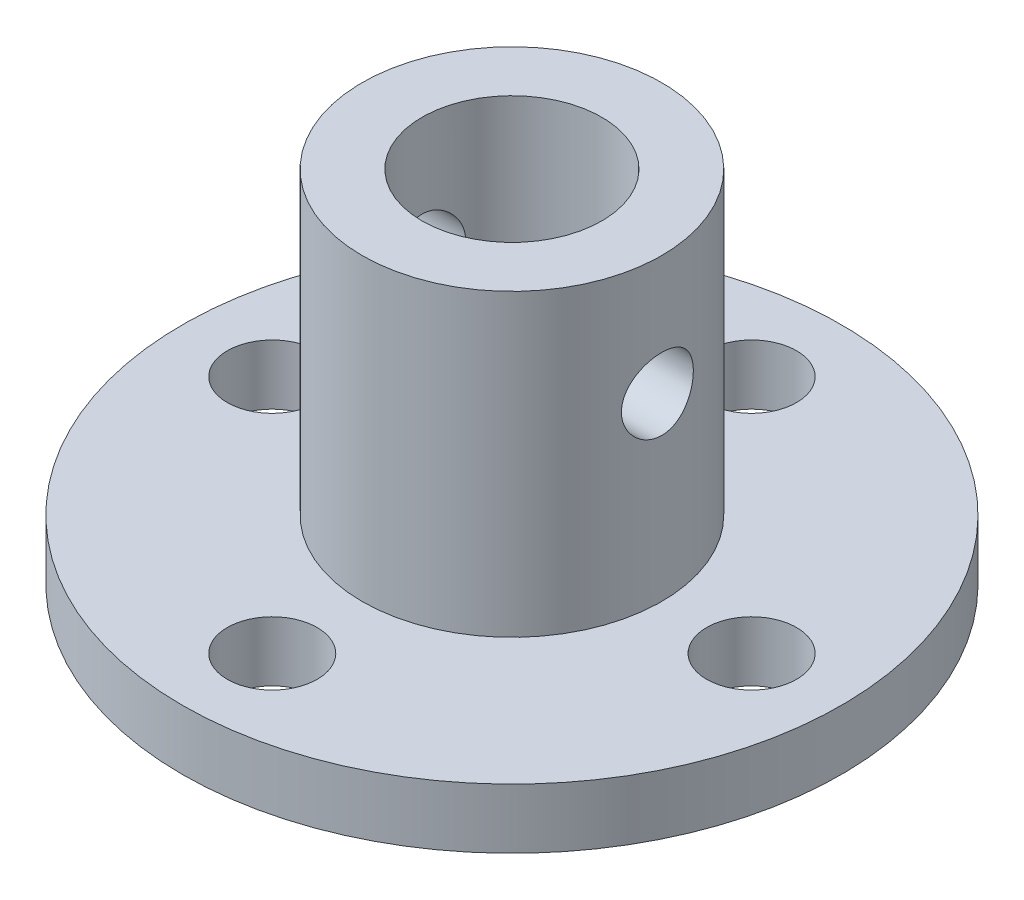
ISO-10303-21;
HEADER;
FILE_DESCRIPTION(('STEP AP214'),'2;1');
FILE_NAME('part.step','',(''),(''),'','','');
FILE_SCHEMA(('AUTOMOTIVE_DESIGN { 1 0 10303 214 1 1 1 1 }'));
ENDSEC;
DATA;
#1=APPLICATION_CONTEXT('core data for automotive mechanical design processes');
#2=APPLICATION_PROTOCOL_DEFINITION('international standard','automotive_design',2000,#1);
#3=PRODUCT_CONTEXT('',#1,'mechanical');
#4=PRODUCT('Part','Part','',(#3));
#5=PRODUCT_RELATED_PRODUCT_CATEGORY('part','',(#4));
#6=PRODUCT_DEFINITION_FORMATION('','',#4);
#7=PRODUCT_DEFINITION_CONTEXT('part definition',#1,'design');
#8=PRODUCT_DEFINITION('design','',#6,#7);
#9=PRODUCT_DEFINITION_SHAPE('','',#8);
#10=(LENGTH_UNIT() NAMED_UNIT(*) SI_UNIT(.MILLI.,.METRE.));
#11=(NAMED_UNIT(*) PLANE_ANGLE_UNIT() SI_UNIT($,.RADIAN.));
#12=(NAMED_UNIT(*) SI_UNIT($,.STERADIAN.) SOLID_ANGLE_UNIT());
#13=UNCERTAINTY_MEASURE_WITH_UNIT(LENGTH_MEASURE(1.E-05),#10,'distance_accuracy_value','');
#14=(GEOMETRIC_REPRESENTATION_CONTEXT(3) GLOBAL_UNCERTAINTY_ASSIGNED_CONTEXT((#13)) GLOBAL_UNIT_ASSIGNED_CONTEXT((#10,
#11,#12)) REPRESENTATION_CONTEXT('',''));
#15=CARTESIAN_POINT('',(0.,0.,0.));
#16=DIRECTION('',(0.,0.,1.));
#17=DIRECTION('',(1.,0.,0.));
#18=AXIS2_PLACEMENT_3D('',#15,#16,#17);
#19=CARTESIAN_POINT('',(0.,2.,0.));
#20=DIRECTION('',(0.,-1.,0.));
#21=DIRECTION('',(0.,0.,-1.));
#22=AXIS2_PLACEMENT_3D('',#19,#20,#21);
#23=CYLINDRICAL_SURFACE('',#22,11.);
#24=CARTESIAN_POINT('',(0.,2.,0.));
#25=DIRECTION('',(0.,1.,0.));
#26=DIRECTION('',(0.,0.,1.));
#27=AXIS2_PLACEMENT_3D('',#24,#25,#26);
#28=CIRCLE('',#27,11.);
#29=CARTESIAN_POINT('',(0.,2.,11.));
#30=VERTEX_POINT('',#29);
#31=EDGE_CURVE('E10',#30,#30,#28,.T.);
#32=ORIENTED_EDGE('',*,*,#31,.F.);
#33=EDGE_LOOP('',(#32));
#34=FACE_BOUND('',#33,.T.);
#35=CARTESIAN_POINT('',(0.,0.,0.));
#36=DIRECTION('',(0.,1.,0.));
#37=DIRECTION('',(0.,0.,1.));
#38=AXIS2_PLACEMENT_3D('',#35,#36,#37);
#39=CIRCLE('',#38,11.);
#40=CARTESIAN_POINT('',(0.,0.,11.));
#41=VERTEX_POINT('',#40);
#42=EDGE_CURVE('E44',#41,#41,#39,.T.);
#43=ORIENTED_EDGE('',*,*,#42,.T.);
#44=EDGE_LOOP('',(#43));
#45=FACE_BOUND('',#44,.T.);
#46=ADVANCED_FACE('F32',(#34,#45),#23,.T.);
#47=CARTESIAN_POINT('',(0.,2.,0.));
#48=DIRECTION('',(0.,1.,0.));
#49=DIRECTION('',(0.,0.,1.));
#50=AXIS2_PLACEMENT_3D('',#47,#48,#49);
#51=PLANE('',#50);
#52=CARTESIAN_POINT('',(8.00000000000023,2.,-2.26393958003914E-13));
#53=DIRECTION('',(0.,1.,0.));
#54=DIRECTION('',(0.,0.,1.));
#55=AXIS2_PLACEMENT_3D('',#52,#53,#54);
#56=CIRCLE('',#55,1.50000000000018);
#57=CARTESIAN_POINT('',(8.00000000000023,2.,1.49999999999995));
#58=VERTEX_POINT('',#57);
#59=EDGE_CURVE('E64',#58,#58,#56,.T.);
#60=ORIENTED_EDGE('',*,*,#59,.F.);
#61=EDGE_LOOP('',(#60));
#62=FACE_BOUND('',#61,.T.);
#63=CARTESIAN_POINT('',(4.52787916007828E-13,2.,8.));
#64=DIRECTION('',(0.,1.,0.));
#65=DIRECTION('',(0.,0.,1.));
#66=AXIS2_PLACEMENT_3D('',#63,#64,#65);
#67=CIRCLE('',#66,1.50000000000049);
#68=CARTESIAN_POINT('',(4.52787916007828E-13,2.,9.50000000000049));
#69=VERTEX_POINT('',#68);
#70=EDGE_CURVE('E229',#69,#69,#67,.T.);
#71=ORIENTED_EDGE('',*,*,#70,.F.);
#72=EDGE_LOOP('',(#71));
#73=FACE_BOUND('',#72,.T.);
#74=CARTESIAN_POINT('',(-7.99999999999977,2.,2.27373675443232E-13));
#75=DIRECTION('',(0.,1.,0.));
#76=DIRECTION('',(0.,0.,1.));
#77=AXIS2_PLACEMENT_3D('',#74,#75,#76);
#78=CIRCLE('',#77,1.50000000000036);
#79=CARTESIAN_POINT('',(-7.99999999999977,2.,1.50000000000059));
#80=VERTEX_POINT('',#79);
#81=EDGE_CURVE('E226',#80,#80,#78,.T.);
#82=ORIENTED_EDGE('',*,*,#81,.F.);
#83=EDGE_LOOP('',(#82));
#84=FACE_BOUND('',#83,.T.);
#85=CARTESIAN_POINT('',(0.,2.,-8.));
#86=DIRECTION('',(0.,1.,0.));
#87=DIRECTION('',(0.,0.,1.));
#88=AXIS2_PLACEMENT_3D('',#85,#86,#87);
#89=CIRCLE('',#88,1.5);
#90=CARTESIAN_POINT('',(0.,2.,-6.5));
#91=VERTEX_POINT('',#90);
#92=EDGE_CURVE('E59',#91,#91,#89,.T.);
#93=ORIENTED_EDGE('',*,*,#92,.F.);
#94=EDGE_LOOP('',(#93));
#95=FACE_BOUND('',#94,.T.);
#96=CARTESIAN_POINT('',(0.,2.,0.));
#97=DIRECTION('',(0.,1.,0.));
#98=DIRECTION('',(0.,0.,1.));
#99=AXIS2_PLACEMENT_3D('',#96,#97,#98);
#100=CIRCLE('',#99,5.);
#101=CARTESIAN_POINT('',(0.,2.,5.));
#102=VERTEX_POINT('',#101);
#103=EDGE_CURVE('E52',#102,#102,#100,.T.);
#104=ORIENTED_EDGE('',*,*,#103,.F.);
#105=EDGE_LOOP('',(#104));
#106=FACE_BOUND('',#105,.T.);
#107=ORIENTED_EDGE('',*,*,#31,.T.);
#108=EDGE_LOOP('',(#107));
#109=FACE_BOUND('',#108,.T.);
#110=ADVANCED_FACE('F109',(#62,#73,#84,#95,#106,#109),#51,.T.);
#111=CARTESIAN_POINT('',(0.,0.,0.));
#112=DIRECTION('',(0.,1.,0.));
#113=DIRECTION('',(0.,0.,1.));
#114=AXIS2_PLACEMENT_3D('',#111,#112,#113);
#115=PLANE('',#114);
#116=CARTESIAN_POINT('',(8.00000000000023,0.,-2.26393958003914E-13));
#117=DIRECTION('',(0.,1.,0.));
#118=DIRECTION('',(0.,0.,1.));
#119=AXIS2_PLACEMENT_3D('',#116,#117,#118);
#120=CIRCLE('',#119,1.50000000000018);
#121=CARTESIAN_POINT('',(8.00000000000023,0.,1.49999999999995));
#122=VERTEX_POINT('',#121);
#123=EDGE_CURVE('E67',#122,#122,#120,.T.);
#124=ORIENTED_EDGE('',*,*,#123,.T.);
#125=EDGE_LOOP('',(#124));
#126=FACE_BOUND('',#125,.T.);
#127=CARTESIAN_POINT('',(4.52787916007828E-13,0.,8.));
#128=DIRECTION('',(0.,1.,0.));
#129=DIRECTION('',(0.,0.,1.));
#130=AXIS2_PLACEMENT_3D('',#127,#128,#129);
#131=CIRCLE('',#130,1.50000000000049);
#132=CARTESIAN_POINT('',(4.52787916007828E-13,0.,9.50000000000049));
#133=VERTEX_POINT('',#132);
#134=EDGE_CURVE('E63',#133,#133,#131,.T.);
#135=ORIENTED_EDGE('',*,*,#134,.T.);
#136=EDGE_LOOP('',(#135));
#137=FACE_BOUND('',#136,.T.);
#138=CARTESIAN_POINT('',(-7.99999999999977,0.,2.27373675443232E-13));
#139=DIRECTION('',(0.,1.,0.));
#140=DIRECTION('',(0.,0.,1.));
#141=AXIS2_PLACEMENT_3D('',#138,#139,#140);
#142=CIRCLE('',#141,1.50000000000036);
#143=CARTESIAN_POINT('',(-7.99999999999977,0.,1.50000000000059));
#144=VERTEX_POINT('',#143);
#145=EDGE_CURVE('E60',#144,#144,#142,.T.);
#146=ORIENTED_EDGE('',*,*,#145,.T.);
#147=EDGE_LOOP('',(#146));
#148=FACE_BOUND('',#147,.T.);
#149=CARTESIAN_POINT('',(0.,0.,-8.));
#150=DIRECTION('',(0.,1.,0.));
#151=DIRECTION('',(0.,0.,1.));
#152=AXIS2_PLACEMENT_3D('',#149,#150,#151);
#153=CIRCLE('',#152,1.5);
#154=CARTESIAN_POINT('',(0.,0.,-6.5));
#155=VERTEX_POINT('',#154);
#156=EDGE_CURVE('E55',#155,#155,#153,.T.);
#157=ORIENTED_EDGE('',*,*,#156,.T.);
#158=EDGE_LOOP('',(#157));
#159=FACE_BOUND('',#158,.T.);
#160=CARTESIAN_POINT('',(0.,0.,0.));
#161=DIRECTION('',(0.,1.,0.));
#162=DIRECTION('',(0.,0.,1.));
#163=AXIS2_PLACEMENT_3D('',#160,#161,#162);
#164=CIRCLE('',#163,3.);
#165=CARTESIAN_POINT('',(0.,0.,3.));
#166=VERTEX_POINT('',#165);
#167=EDGE_CURVE('E216',#166,#166,#164,.T.);
#168=ORIENTED_EDGE('',*,*,#167,.T.);
#169=EDGE_LOOP('',(#168));
#170=FACE_BOUND('',#169,.T.);
#171=ORIENTED_EDGE('',*,*,#42,.F.);
#172=EDGE_LOOP('',(#171));
#173=FACE_BOUND('',#172,.T.);
#174=ADVANCED_FACE('F107',(#126,#137,#148,#159,#170,#173),#115,.F.);
#175=CARTESIAN_POINT('',(0.,12.,0.));
#176=DIRECTION('',(0.,-1.,0.));
#177=DIRECTION('',(0.,0.,-1.));
#178=AXIS2_PLACEMENT_3D('',#175,#176,#177);
#179=CYLINDRICAL_SURFACE('',#178,5.);
#180=CARTESIAN_POINT('',(-4.85386443980464,8.,-1.2));
#181=CARTESIAN_POINT('',(-4.85386574834956,8.06635452557652,-1.1999979705578));
#182=CARTESIAN_POINT('',(-4.85523993119247,8.13273212072872,-1.19447760630204));
#183=CARTESIAN_POINT('',(-4.8605754799883,8.2635873410881,-1.17257348950943));
#184=CARTESIAN_POINT('',(-4.86453847215855,8.32806374539526,-1.156182908509));
#185=CARTESIAN_POINT('',(-4.87457754147826,8.4532049181611,-1.11309435138135));
#186=CARTESIAN_POINT('',(-4.88065102731292,8.51387425367759,-1.08640901099969));
#187=CARTESIAN_POINT('',(-4.89422356910218,8.62987981746289,-1.02352620715788));
#188=CARTESIAN_POINT('',(-4.90172265612421,8.68521592946782,-0.98732853639367));
#189=CARTESIAN_POINT('',(-4.91747172337779,8.79010752597607,-0.905664368660577));
#190=CARTESIAN_POINT('',(-4.92573292327146,8.83953886239581,-0.860040546351182));
#191=CARTESIAN_POINT('',(-4.94197776786566,8.93012615777367,-0.761158305263485));
#192=CARTESIAN_POINT('',(-4.94996138808952,8.97128138847705,-0.707899215326602));
#193=CARTESIAN_POINT('',(-4.96487503831898,9.0446505730824,-0.594413740032978));
#194=CARTESIAN_POINT('',(-4.9717902836032,9.07674340941971,-0.534106940562792));
#195=CARTESIAN_POINT('',(-4.98366044385166,9.13029061492714,-0.408761457376199));
#196=CARTESIAN_POINT('',(-4.98861562472599,9.15174642725813,-0.34372341693697));
#197=CARTESIAN_POINT('',(-4.99592803621097,9.18301526175459,-0.212054861119564));
#198=CARTESIAN_POINT('',(-4.99833220128179,9.19303888568329,-0.145477011016399));
#199=CARTESIAN_POINT('',(-5.00043493925753,9.20181900787666,-0.0115442295903432));
#200=CARTESIAN_POINT('',(-5.00013388201989,9.20057704636966,0.055810594247324));
#201=CARTESIAN_POINT('',(-4.99689534571203,9.187014519686,0.187927678875519));
#202=CARTESIAN_POINT('',(-4.99401193949727,9.17492116633258,0.252714787646842));
#203=CARTESIAN_POINT('',(-4.98599518389802,9.14036330481486,0.379311966331709));
#204=CARTESIAN_POINT('',(-4.98086172025245,9.11789826995886,0.441121884882393));
#205=CARTESIAN_POINT('',(-4.96883750692918,9.06304526690089,0.56061940318406));
#206=CARTESIAN_POINT('',(-4.9619322123624,9.03057469769263,0.618267562959191));
#207=CARTESIAN_POINT('',(-4.94711614602281,8.95669462653349,0.727377499260279));
#208=CARTESIAN_POINT('',(-4.93920521180944,8.91528367969069,0.778838273721493));
#209=CARTESIAN_POINT('',(-4.92300938183712,8.82347383956616,0.875466704291571));
#210=CARTESIAN_POINT('',(-4.91472008098886,8.77287625353241,0.920445028443142));
#211=CARTESIAN_POINT('',(-4.89888404902298,8.66476974553664,1.00131821955703));
#212=CARTESIAN_POINT('',(-4.89133734727314,8.60726055043877,1.03721272736709));
#213=CARTESIAN_POINT('',(-4.87782644988181,8.48661389749472,1.09900794525505));
#214=CARTESIAN_POINT('',(-4.8718689814022,8.42345397956931,1.12486637653164));
#215=CARTESIAN_POINT('',(-4.86229932919542,8.2935067506094,1.16554129726684));
#216=CARTESIAN_POINT('',(-4.85868668784527,8.22672015012718,1.18035994136453));
#217=CARTESIAN_POINT('',(-4.8543109065439,8.0931626479757,1.19822740093828));
#218=CARTESIAN_POINT('',(-4.85348035194831,8.02643117100062,1.20155473331588));
#219=CARTESIAN_POINT('',(-4.85457982488721,7.89336672237327,1.19710481364215));
#220=CARTESIAN_POINT('',(-4.85650962025667,7.82703371767786,1.18932849548677));
#221=CARTESIAN_POINT('',(-4.8628480607639,7.69766163309304,1.16313540811095));
#222=CARTESIAN_POINT('',(-4.86721959037932,7.63458832963254,1.14487784593919));
#223=CARTESIAN_POINT('',(-4.87791428510207,7.51239687173387,1.0984156599552));
#224=CARTESIAN_POINT('',(-4.88423766714648,7.45327915782567,1.07020993041214));
#225=CARTESIAN_POINT('',(-4.89826757064917,7.33948849911823,1.00405897470492));
#226=CARTESIAN_POINT('',(-4.90599720896891,7.28491625039753,0.965945543261206));
#227=CARTESIAN_POINT('',(-4.92191059520354,7.18283970644249,0.881276206441526));
#228=CARTESIAN_POINT('',(-4.93009441150586,7.13533647960583,0.834719027249052));
#229=CARTESIAN_POINT('',(-4.94622044561256,7.04763399615629,0.733211442050559));
#230=CARTESIAN_POINT('',(-4.95415286604867,7.00762649760413,0.678093519796222));
#231=CARTESIAN_POINT('',(-4.96868773599825,6.93743661476599,0.561759047226883));
#232=CARTESIAN_POINT('',(-4.97529025311405,6.90725373102214,0.500542807141209));
#233=CARTESIAN_POINT('',(-4.98638083813349,6.85782100908999,0.374162473013356));
#234=CARTESIAN_POINT('',(-4.99088358502535,6.83849507179135,0.309029492813407));
#235=CARTESIAN_POINT('',(-4.99733131235137,6.81109287184125,0.176319006648483));
#236=CARTESIAN_POINT('',(-4.99927674530205,6.8030146188978,0.108741935340385));
#237=CARTESIAN_POINT('',(-5.00037384681398,6.79844165288519,-0.0251309330151677));
#238=CARTESIAN_POINT('',(-4.99959402361891,6.80166289762338,-0.0914166194368341));
#239=CARTESIAN_POINT('',(-4.99547843914621,6.818951985207,-0.222472635242497));
#240=CARTESIAN_POINT('',(-4.99214274325727,6.83301955056341,-0.287243003350266));
#241=CARTESIAN_POINT('',(-4.98329901613138,6.87145473004636,-0.413158134552165));
#242=CARTESIAN_POINT('',(-4.97780105635323,6.89577462777663,-0.474318216072177));
#243=CARTESIAN_POINT('',(-4.96521431839506,6.95398009765915,-0.591723649676363));
#244=CARTESIAN_POINT('',(-4.95812535402572,6.98786678949741,-0.647968425469445));
#245=CARTESIAN_POINT('',(-4.94292611630122,7.06513018971189,-0.755306804615817));
#246=CARTESIAN_POINT('',(-4.93479656171732,7.10870202830168,-0.806257226493132));
#247=CARTESIAN_POINT('',(-4.91852450984834,7.20371504423164,-0.90021980625846));
#248=CARTESIAN_POINT('',(-4.9103820098469,7.25515817627866,-0.943229986447174));
#249=CARTESIAN_POINT('',(-4.89485102555881,7.36549575767818,-1.02079794075124));
#250=CARTESIAN_POINT('',(-4.8874775389275,7.42450104825922,-1.05520126656998));
#251=CARTESIAN_POINT('',(-4.87451638676983,7.5476247386592,-1.1135482836119));
#252=CARTESIAN_POINT('',(-4.86892735049339,7.61173916628369,-1.13750000858815));
#253=CARTESIAN_POINT('',(-4.86109564328101,7.72983714139588,-1.17045774554031));
#254=CARTESIAN_POINT('',(-4.85840351753819,7.78322833128185,-1.18151294684131));
#255=CARTESIAN_POINT('',(-4.85478744190151,7.89107454963095,-1.19628464477187));
#256=CARTESIAN_POINT('',(-4.85386336561877,7.94552950176998,-1.20000166597119));
#257=CARTESIAN_POINT('',(-4.85386443980464,8.,-1.2));
#258=B_SPLINE_CURVE_WITH_KNOTS('',3,(#180,#181,#182,#183,#184,#185,#186,#187,#188,#189,#190,
#191,#192,#193,#194,#195,#196,#197,#198,#199,#200,#201,#202,#203,#204,#205,#206,#207,#208,#209,
#210,#211,#212,#213,#214,#215,#216,#217,#218,#219,#220,#221,#222,#223,#224,#225,#226,#227,#228,
#229,#230,#231,#232,#233,#234,#235,#236,#237,#238,#239,#240,#241,#242,#243,#244,#245,#246,#247,
#248,#249,#250,#251,#252,#253,#254,#255,#256,#257),.UNSPECIFIED.,.T.,.F.,(4,2,2,2,2,2,2,2,2,2,2,
2,2,2,2,2,2,2,2,2,2,2,2,2,2,2,2,2,2,2,2,2,2,2,2,2,2,2,4),(0.,0.198863684875774,0.39785241061556,
0.596597671501016,0.795347264039442,0.99772967277618,1.20012988233894,1.40511932306521,
1.61008094456725,1.81120251394427,2.01229658643974,2.20927584611689,2.40626510983779,
2.60492628768566,2.80361959606555,3.00727667386884,3.21094180252581,3.41545582890608,
3.61992992974891,3.81941198396489,4.01887726131023,4.2153899929423,4.4119245736942,
4.61204261040561,4.81219086190157,5.01691376492014,5.22162625873254,5.42488537167321,
5.62810851308336,5.82626011732859,6.02440665229056,6.22164098170181,6.41889840475702,
6.6205634308204,6.82227861861519,7.02738891173642,7.23234126535601,7.39560033961485,
7.55884774287673),.UNSPECIFIED.);
#259=CARTESIAN_POINT('',(-4.85386443980464,8.,-1.2));
#260=VERTEX_POINT('',#259);
#261=EDGE_CURVE('E97',#260,#260,#258,.T.);
#262=ORIENTED_EDGE('',*,*,#261,.T.);
#263=EDGE_LOOP('',(#262));
#264=FACE_BOUND('',#263,.T.);
#265=CARTESIAN_POINT('',(4.85386443980464,8.,-1.2));
#266=CARTESIAN_POINT('',(4.85386574834956,7.93364547442348,-1.1999979705578));
#267=CARTESIAN_POINT('',(4.85523993119247,7.86726787927128,-1.19447760630204));
#268=CARTESIAN_POINT('',(4.8605754799883,7.7364126589119,-1.17257348950943));
#269=CARTESIAN_POINT('',(4.86453847215855,7.67193625460474,-1.156182908509));
#270=CARTESIAN_POINT('',(4.87457754147826,7.5467950818389,-1.11309435138135));
#271=CARTESIAN_POINT('',(4.88065102731292,7.48612574632241,-1.08640901099969));
#272=CARTESIAN_POINT('',(4.89422356910218,7.37012018253711,-1.02352620715788));
#273=CARTESIAN_POINT('',(4.90172265612421,7.31478407053218,-0.987328536393669));
#274=CARTESIAN_POINT('',(4.91747172337779,7.20989247402393,-0.905664368660575));
#275=CARTESIAN_POINT('',(4.92573292327146,7.16046113760419,-0.86004054635118));
#276=CARTESIAN_POINT('',(4.94197776786566,7.06987384222633,-0.761158305263483));
#277=CARTESIAN_POINT('',(4.94996138808952,7.02871861152295,-0.707899215326601));
#278=CARTESIAN_POINT('',(4.96487503831898,6.9553494269176,-0.594413740032977));
#279=CARTESIAN_POINT('',(4.9717902836032,6.92325659058029,-0.534106940562791));
#280=CARTESIAN_POINT('',(4.98366044385166,6.86970938507286,-0.408761457376198));
#281=CARTESIAN_POINT('',(4.98861562472599,6.84825357274187,-0.343723416936969));
#282=CARTESIAN_POINT('',(4.99592803621097,6.81698473824541,-0.212054861119563));
#283=CARTESIAN_POINT('',(4.99833220128179,6.80696111431671,-0.145477011016399));
#284=CARTESIAN_POINT('',(5.00043493925753,6.79818099212334,-0.0115442295903428));
#285=CARTESIAN_POINT('',(5.00013388201989,6.79942295363034,0.0558105942473242));
#286=CARTESIAN_POINT('',(4.99689534571203,6.812985480314,0.187927678875519));
#287=CARTESIAN_POINT('',(4.99401193949727,6.82507883366743,0.252714787646843));
#288=CARTESIAN_POINT('',(4.98599518389802,6.85963669518514,0.379311966331709));
#289=CARTESIAN_POINT('',(4.98086172025244,6.88210173004114,0.441121884882393));
#290=CARTESIAN_POINT('',(4.96883750692918,6.93695473309911,0.56061940318406));
#291=CARTESIAN_POINT('',(4.9619322123624,6.96942530230737,0.61826756295919));
#292=CARTESIAN_POINT('',(4.94711614602281,7.04330537346652,0.727377499260278));
#293=CARTESIAN_POINT('',(4.93920521180944,7.08471632030931,0.778838273721493));
#294=CARTESIAN_POINT('',(4.92300938183712,7.17652616043384,0.875466704291571));
#295=CARTESIAN_POINT('',(4.91472008098886,7.22712374646759,0.920445028443141));
#296=CARTESIAN_POINT('',(4.89888404902298,7.33523025446336,1.00131821955703));
#297=CARTESIAN_POINT('',(4.89133734727314,7.39273944956123,1.03721272736709));
#298=CARTESIAN_POINT('',(4.87782644988181,7.51338610250528,1.09900794525505));
#299=CARTESIAN_POINT('',(4.8718689814022,7.57654602043069,1.12486637653164));
#300=CARTESIAN_POINT('',(4.86229932919542,7.7064932493906,1.16554129726684));
#301=CARTESIAN_POINT('',(4.85868668784527,7.77327984987282,1.18035994136453));
#302=CARTESIAN_POINT('',(4.8543109065439,7.9068373520243,1.19822740093827));
#303=CARTESIAN_POINT('',(4.85348035194831,7.97356882899938,1.20155473331588));
#304=CARTESIAN_POINT('',(4.85457982488721,8.10663327762673,1.19710481364215));
#305=CARTESIAN_POINT('',(4.85650962025667,8.17296628232214,1.18932849548677));
#306=CARTESIAN_POINT('',(4.8628480607639,8.30233836690696,1.16313540811095));
#307=CARTESIAN_POINT('',(4.86721959037932,8.36541167036746,1.14487784593919));
#308=CARTESIAN_POINT('',(4.87791428510207,8.48760312826613,1.0984156599552));
#309=CARTESIAN_POINT('',(4.88423766714648,8.54672084217433,1.07020993041214));
#310=CARTESIAN_POINT('',(4.89826757064917,8.66051150088177,1.00405897470492));
#311=CARTESIAN_POINT('',(4.90599720896891,8.71508374960247,0.965945543261206));
#312=CARTESIAN_POINT('',(4.92191059520354,8.81716029355751,0.881276206441526));
#313=CARTESIAN_POINT('',(4.93009441150586,8.86466352039417,0.834719027249052));
#314=CARTESIAN_POINT('',(4.94622044561256,8.95236600384371,0.733211442050559));
#315=CARTESIAN_POINT('',(4.95415286604867,8.99237350239587,0.678093519796221));
#316=CARTESIAN_POINT('',(4.96868773599825,9.06256338523401,0.561759047226882));
#317=CARTESIAN_POINT('',(4.97529025311405,9.09274626897786,0.500542807141208));
#318=CARTESIAN_POINT('',(4.98638083813349,9.14217899091001,0.374162473013356));
#319=CARTESIAN_POINT('',(4.99088358502535,9.16150492820865,0.309029492813406));
#320=CARTESIAN_POINT('',(4.99733131235136,9.18890712815875,0.176319006648483));
#321=CARTESIAN_POINT('',(4.99927674530205,9.1969853811022,0.108741935340385));
#322=CARTESIAN_POINT('',(5.00037384681398,9.20155834711481,-0.0251309330151674));
#323=CARTESIAN_POINT('',(4.99959402361891,9.19833710237662,-0.091416619436834));
#324=CARTESIAN_POINT('',(4.99547843914621,9.181048014793,-0.222472635242497));
#325=CARTESIAN_POINT('',(4.99214274325727,9.1669804494366,-0.287243003350266));
#326=CARTESIAN_POINT('',(4.98329901613138,9.12854526995364,-0.413158134552164));
#327=CARTESIAN_POINT('',(4.97780105635323,9.10422537222338,-0.474318216072177));
#328=CARTESIAN_POINT('',(4.96521431839506,9.04601990234086,-0.591723649676363));
#329=CARTESIAN_POINT('',(4.95812535402572,9.01213321050259,-0.647968425469445));
#330=CARTESIAN_POINT('',(4.94292611630122,8.93486981028811,-0.755306804615817));
#331=CARTESIAN_POINT('',(4.93479656171732,8.89129797169832,-0.806257226493132));
#332=CARTESIAN_POINT('',(4.91852450984834,8.79628495576836,-0.90021980625846));
#333=CARTESIAN_POINT('',(4.9103820098469,8.74484182372134,-0.943229986447174));
#334=CARTESIAN_POINT('',(4.89485102555881,8.63450424232182,-1.02079794075124));
#335=CARTESIAN_POINT('',(4.8874775389275,8.57549895174078,-1.05520126656998));
#336=CARTESIAN_POINT('',(4.87451638676983,8.4523752613408,-1.1135482836119));
#337=CARTESIAN_POINT('',(4.86892735049339,8.38826083371631,-1.13750000858815));
#338=CARTESIAN_POINT('',(4.86109564328101,8.27016285860412,-1.17045774554031));
#339=CARTESIAN_POINT('',(4.85840351753819,8.21677166871815,-1.18151294684131));
#340=CARTESIAN_POINT('',(4.85478744190151,8.10892545036905,-1.19628464477187));
#341=CARTESIAN_POINT('',(4.85386336561877,8.05447049823002,-1.20000166597119));
#342=CARTESIAN_POINT('',(4.85386443980464,8.,-1.2));
#343=B_SPLINE_CURVE_WITH_KNOTS('',3,(#265,#266,#267,#268,#269,#270,#271,#272,#273,#274,#275,
#276,#277,#278,#279,#280,#281,#282,#283,#284,#285,#286,#287,#288,#289,#290,#291,#292,#293,#294,
#295,#296,#297,#298,#299,#300,#301,#302,#303,#304,#305,#306,#307,#308,#309,#310,#311,#312,#313,
#314,#315,#316,#317,#318,#319,#320,#321,#322,#323,#324,#325,#326,#327,#328,#329,#330,#331,#332,
#333,#334,#335,#336,#337,#338,#339,#340,#341,#342),.UNSPECIFIED.,.T.,.F.,(4,2,2,2,2,2,2,2,2,2,2,
2,2,2,2,2,2,2,2,2,2,2,2,2,2,2,2,2,2,2,2,2,2,2,2,2,2,2,4),(0.,0.198863684875774,0.39785241061556,
0.596597671501018,0.795347264039444,0.997729672776182,1.20012988233894,1.40511932306521,
1.61008094456725,1.81120251394427,2.01229658643974,2.20927584611689,2.40626510983779,
2.60492628768566,2.80361959606555,3.00727667386883,3.21094180252581,3.41545582890608,
3.61992992974891,3.81941198396489,4.01887726131023,4.2153899929423,4.4119245736942,
4.61204261040561,4.81219086190157,5.01691376492014,5.22162625873255,5.42488537167321,
5.62810851308336,5.8262601173286,6.02440665229056,6.22164098170181,6.41889840475702,
6.6205634308204,6.82227861861519,7.02738891173642,7.23234126535601,7.39560033961485,
7.55884774287674),.UNSPECIFIED.);
#344=CARTESIAN_POINT('',(4.85386443980464,8.,-1.2));
#345=VERTEX_POINT('',#344);
#346=EDGE_CURVE('E91',#345,#345,#343,.T.);
#347=ORIENTED_EDGE('',*,*,#346,.T.);
#348=EDGE_LOOP('',(#347));
#349=FACE_BOUND('',#348,.T.);
#350=CARTESIAN_POINT('',(0.,12.,0.));
#351=DIRECTION('',(0.,1.,0.));
#352=DIRECTION('',(0.,0.,1.));
#353=AXIS2_PLACEMENT_3D('',#350,#351,#352);
#354=CIRCLE('',#353,5.);
#355=CARTESIAN_POINT('',(0.,12.,5.));
#356=VERTEX_POINT('',#355);
#357=EDGE_CURVE('E49',#356,#356,#354,.T.);
#358=ORIENTED_EDGE('',*,*,#357,.F.);
#359=EDGE_LOOP('',(#358));
#360=FACE_BOUND('',#359,.T.);
#361=ORIENTED_EDGE('',*,*,#103,.T.);
#362=EDGE_LOOP('',(#361));
#363=FACE_BOUND('',#362,.T.);
#364=ADVANCED_FACE('F102',(#264,#349,#360,#363),#179,.T.);
#365=CARTESIAN_POINT('',(0.,12.,0.));
#366=DIRECTION('',(0.,1.,0.));
#367=DIRECTION('',(0.,0.,1.));
#368=AXIS2_PLACEMENT_3D('',#365,#366,#367);
#369=PLANE('',#368);
#370=CARTESIAN_POINT('',(0.,12.,0.));
#371=DIRECTION('',(0.,1.,0.));
#372=DIRECTION('',(0.,0.,1.));
#373=AXIS2_PLACEMENT_3D('',#370,#371,#372);
#374=CIRCLE('',#373,3.);
#375=CARTESIAN_POINT('',(0.,12.,3.));
#376=VERTEX_POINT('',#375);
#377=EDGE_CURVE('E58',#376,#376,#374,.T.);
#378=ORIENTED_EDGE('',*,*,#377,.F.);
#379=EDGE_LOOP('',(#378));
#380=FACE_BOUND('',#379,.T.);
#381=ORIENTED_EDGE('',*,*,#357,.T.);
#382=EDGE_LOOP('',(#381));
#383=FACE_BOUND('',#382,.T.);
#384=ADVANCED_FACE('F106',(#380,#383),#369,.T.);
#385=CARTESIAN_POINT('',(0.,0.,0.));
#386=DIRECTION('',(0.,1.,0.));
#387=DIRECTION('',(0.,0.,1.));
#388=AXIS2_PLACEMENT_3D('',#385,#386,#387);
#389=CYLINDRICAL_SURFACE('',#388,3.);
#390=CARTESIAN_POINT('',(-2.7495454169735,8.,-1.2));
#391=CARTESIAN_POINT('',(-2.74955190993853,7.93571630114007,-1.19999295252227));
#392=CARTESIAN_POINT('',(-2.75183161490559,7.87134167917718,-1.19480389115661));
#393=CARTESIAN_POINT('',(-2.76066548512707,7.74443910027376,-1.17424141835564));
#394=CARTESIAN_POINT('',(-2.76723057232111,7.68191628975171,-1.15884198266528));
#395=CARTESIAN_POINT('',(-2.78376273474778,7.56076823481797,-1.11854101954122));
#396=CARTESIAN_POINT('',(-2.79371697814269,7.50212927158385,-1.09367529151525));
#397=CARTESIAN_POINT('',(-2.81588799057168,7.38986896948423,-1.03525216162297));
#398=CARTESIAN_POINT('',(-2.82810426542354,7.33624653850949,-1.0016966575605));
#399=CARTESIAN_POINT('',(-2.8542051903062,7.23244375865513,-0.924793184752451));
#400=CARTESIAN_POINT('',(-2.86814350775248,7.18258614624232,-0.881027614636396));
#401=CARTESIAN_POINT('',(-2.89567474187287,7.09068260161078,-0.785825463464426));
#402=CARTESIAN_POINT('',(-2.90926753641823,7.04863939922608,-0.734386213005408));
#403=CARTESIAN_POINT('',(-2.93522044744113,6.97195616181038,-0.622803786213827));
#404=CARTESIAN_POINT('',(-2.94751082210141,6.93767341911761,-0.562397379367369));
#405=CARTESIAN_POINT('',(-2.96882356578928,6.87989385896612,-0.436095193725072));
#406=CARTESIAN_POINT('',(-2.97784726430804,6.85639265253083,-0.370201661572777));
#407=CARTESIAN_POINT('',(-2.99122995004971,6.82199510813756,-0.238179856103335));
#408=CARTESIAN_POINT('',(-2.99579362065214,6.81054361154659,-0.172217390882763));
#409=CARTESIAN_POINT('',(-3.00048186409622,6.79878290860238,-0.0391597971825906));
#410=CARTESIAN_POINT('',(-3.00060809261588,6.79846954643909,0.0279348994952418));
#411=CARTESIAN_POINT('',(-2.99653177693071,6.80868966186499,0.157339496829187));
#412=CARTESIAN_POINT('',(-2.99257198063102,6.81861486364816,0.219706471724421));
#413=CARTESIAN_POINT('',(-2.98109574881274,6.84799572578645,0.341803865531003));
#414=CARTESIAN_POINT('',(-2.97357905232667,6.86745208544023,0.401534090634095));
#415=CARTESIAN_POINT('',(-2.9555809467462,6.91558188972578,0.517738763106994));
#416=CARTESIAN_POINT('',(-2.9450565628008,6.94438982888932,0.57415057402778));
#417=CARTESIAN_POINT('',(-2.92208751107819,7.01027900415141,0.681484890444345));
#418=CARTESIAN_POINT('',(-2.90964218559044,7.04736307585857,0.732405505629666));
#419=CARTESIAN_POINT('',(-2.88312982307,7.13158948156796,0.830861296795291));
#420=CARTESIAN_POINT('',(-2.86900995912144,7.1792323355503,0.877954707164185));
#421=CARTESIAN_POINT('',(-2.84136996578867,7.28179434309258,0.963664449231195));
#422=CARTESIAN_POINT('',(-2.82785003385808,7.3367158688925,1.00227800625579));
#423=CARTESIAN_POINT('',(-2.80258138465087,7.45425141344537,1.07094251324576));
#424=CARTESIAN_POINT('',(-2.79089348508829,7.51703889829029,1.10072079104094));
#425=CARTESIAN_POINT('',(-2.77132554280394,7.64732929427721,1.14910575597976));
#426=CARTESIAN_POINT('',(-2.76344302754004,7.71482911086251,1.16771969904264));
#427=CARTESIAN_POINT('',(-2.75297855803539,7.84822146646163,1.19217296929917));
#428=CARTESIAN_POINT('',(-2.75010219868845,7.9139602682721,1.19872325808505));
#429=CARTESIAN_POINT('',(-2.74913698726259,8.04564632466077,1.20093679586941));
#430=CARTESIAN_POINT('',(-2.75104668337478,8.1115935099667,1.19660334635573));
#431=CARTESIAN_POINT('',(-2.75913626614279,8.23787536097293,1.17781973687311));
#432=CARTESIAN_POINT('',(-2.76506674678662,8.2983157624397,1.16395983721407));
#433=CARTESIAN_POINT('',(-2.78022030616723,8.4159730428716,1.12728251214677));
#434=CARTESIAN_POINT('',(-2.78944411493246,8.47318920386439,1.10446310058144));
#435=CARTESIAN_POINT('',(-2.8106026911597,8.58536141467729,1.04948138368887));
#436=CARTESIAN_POINT('',(-2.82263222783481,8.64013171321667,1.01697772095876));
#437=CARTESIAN_POINT('',(-2.84790231094702,8.743689792465,0.943899134665125));
#438=CARTESIAN_POINT('',(-2.86114334937638,8.79247512367736,0.903320924089189));
#439=CARTESIAN_POINT('',(-2.88852549582838,8.88642404515953,0.811706527008288));
#440=CARTESIAN_POINT('',(-2.90266084371121,8.93105393917462,0.760119257667058));
#441=CARTESIAN_POINT('',(-2.92931876740538,9.0111062459662,0.649850180021305));
#442=CARTESIAN_POINT('',(-2.94184127755944,9.04652828395834,0.591168083080717));
#443=CARTESIAN_POINT('',(-2.96390229540171,9.10702857587674,0.468167960401056));
#444=CARTESIAN_POINT('',(-2.97344151744164,9.13210930649947,0.403851288596439));
#445=CARTESIAN_POINT('',(-2.98843628081574,9.17092931144458,0.271436154551534));
#446=CARTESIAN_POINT('',(-2.99389403824526,9.18467474086404,0.203339766176561));
#447=CARTESIAN_POINT('',(-2.99987404926307,9.19970282097523,0.070089906207782));
#448=CARTESIAN_POINT('',(-3.00069508046924,9.20174007707759,0.00503429555583316));
#449=CARTESIAN_POINT('',(-2.99811625427156,9.19528671242954,-0.124460301439946));
#450=CARTESIAN_POINT('',(-2.99471703580148,9.18679768532863,-0.188899379636774));
#451=CARTESIAN_POINT('',(-2.98422908018553,9.16007192698491,-0.313302541167847));
#452=CARTESIAN_POINT('',(-2.97725688380598,9.14214263235467,-0.373343282789032));
#453=CARTESIAN_POINT('',(-2.96036968699222,9.09736831726291,-0.489553412855364));
#454=CARTESIAN_POINT('',(-2.95045414382407,9.07052165238779,-0.545722084960366));
#455=CARTESIAN_POINT('',(-2.92810856616035,9.0073380809064,-0.65532182511367));
#456=CARTESIAN_POINT('',(-2.91558677836938,8.97063422306895,-0.708522232083856));
#457=CARTESIAN_POINT('',(-2.88953641911868,8.88932688849264,-0.808232417114444));
#458=CARTESIAN_POINT('',(-2.876007432303,8.84472014212393,-0.854739411447454));
#459=CARTESIAN_POINT('',(-2.84842658135653,8.74561086528497,-0.942720759051596));
#460=CARTESIAN_POINT('',(-2.8343941956323,8.69066667595933,-0.983705332319418));
#461=CARTESIAN_POINT('',(-2.80829802885108,8.57423471754274,-1.05590847026364));
#462=CARTESIAN_POINT('',(-2.79623447932473,8.51274618025409,-1.08712588673999));
#463=CARTESIAN_POINT('',(-2.77655318674745,8.39057767889116,-1.13639465260399));
#464=CARTESIAN_POINT('',(-2.76863351166989,8.33032085914929,-1.15537650849852));
#465=CARTESIAN_POINT('',(-2.75667602162378,8.2073087482218,-1.18363065469103));
#466=CARTESIAN_POINT('',(-2.75262739243305,8.14456093041982,-1.19293000073281));
#467=CARTESIAN_POINT('',(-2.74994675254581,8.05437346259724,-1.1990785549861));
#468=CARTESIAN_POINT('',(-2.74954267016014,8.02719486740144,-1.20000298139693));
#469=CARTESIAN_POINT('',(-2.7495454169735,8.,-1.2));
#470=B_SPLINE_CURVE_WITH_KNOTS('',3,(#390,#391,#392,#393,#394,#395,#396,#397,#398,#399,#400,
#401,#402,#403,#404,#405,#406,#407,#408,#409,#410,#411,#412,#413,#414,#415,#416,#417,#418,#419,
#420,#421,#422,#423,#424,#425,#426,#427,#428,#429,#430,#431,#432,#433,#434,#435,#436,#437,#438,
#439,#440,#441,#442,#443,#444,#445,#446,#447,#448,#449,#450,#451,#452,#453,#454,#455,#456,#457,
#458,#459,#460,#461,#462,#463,#464,#465,#466,#467,#468,#469),.UNSPECIFIED.,.T.,.F.,(4,2,2,2,2,2,
2,2,2,2,2,2,2,2,2,2,2,2,2,2,2,2,2,2,2,2,2,2,2,2,2,2,2,2,2,2,2,2,2,4),(0.,0.192766589260592,
0.386026401493348,0.578562493976034,0.771056572943169,0.973533709706549,1.17608144609005,
1.38661601454857,1.59706480181688,1.7973250973231,1.99751067183403,2.18645186898181,
2.37540693077436,2.56720980140939,2.75907848964019,2.96354426448813,3.16807684276276,
3.37838675228746,3.58855982876467,3.78589288511058,3.9831660894117,4.16920348847493,
4.35528215187388,4.54890692788026,4.74261068711916,4.95062240544594,5.15864258908055,
5.36661292384093,5.57447025568888,5.76876623849978,5.96303280903967,6.15133196662417,
6.33966586693557,6.53632230680361,6.73306029934929,6.94197751967774,7.15091929051919,
7.34109996487852,7.53074778127952,7.6122966331244),.UNSPECIFIED.);
#471=CARTESIAN_POINT('',(-2.7495454169735,8.,-1.2));
#472=VERTEX_POINT('',#471);
#473=EDGE_CURVE('E35',#472,#472,#470,.T.);
#474=ORIENTED_EDGE('',*,*,#473,.T.);
#475=EDGE_LOOP('',(#474));
#476=FACE_BOUND('',#475,.T.);
#477=CARTESIAN_POINT('',(2.7495454169735,8.,-1.2));
#478=CARTESIAN_POINT('',(2.74955190993853,8.06428369885993,-1.19999295252227));
#479=CARTESIAN_POINT('',(2.75183161490559,8.12865832082282,-1.19480389115661));
#480=CARTESIAN_POINT('',(2.76066548512707,8.25556089972624,-1.17424141835564));
#481=CARTESIAN_POINT('',(2.76723057232111,8.31808371024829,-1.15884198266528));
#482=CARTESIAN_POINT('',(2.78376273474778,8.43923176518203,-1.11854101954122));
#483=CARTESIAN_POINT('',(2.79371697814269,8.49787072841615,-1.09367529151526));
#484=CARTESIAN_POINT('',(2.81588799057168,8.61013103051577,-1.03525216162297));
#485=CARTESIAN_POINT('',(2.82810426542354,8.66375346149051,-1.0016966575605));
#486=CARTESIAN_POINT('',(2.8542051903062,8.76755624134487,-0.924793184752452));
#487=CARTESIAN_POINT('',(2.86814350775248,8.81741385375768,-0.881027614636397));
#488=CARTESIAN_POINT('',(2.89567474187287,8.90931739838922,-0.785825463464427));
#489=CARTESIAN_POINT('',(2.90926753641823,8.95136060077392,-0.734386213005408));
#490=CARTESIAN_POINT('',(2.93522044744113,9.02804383818962,-0.622803786213827));
#491=CARTESIAN_POINT('',(2.94751082210141,9.06232658088239,-0.562397379367369));
#492=CARTESIAN_POINT('',(2.96882356578928,9.12010614103388,-0.436095193725073));
#493=CARTESIAN_POINT('',(2.97784726430804,9.14360734746917,-0.370201661572778));
#494=CARTESIAN_POINT('',(2.99122995004971,9.17800489186244,-0.238179856103336));
#495=CARTESIAN_POINT('',(2.99579362065214,9.18945638845341,-0.172217390882764));
#496=CARTESIAN_POINT('',(3.00048186409622,9.20121709139762,-0.0391597971825917));
#497=CARTESIAN_POINT('',(3.00060809261588,9.20153045356091,0.0279348994952407));
#498=CARTESIAN_POINT('',(2.99653177693071,9.19131033813501,0.157339496829186));
#499=CARTESIAN_POINT('',(2.99257198063102,9.18138513635184,0.219706471724419));
#500=CARTESIAN_POINT('',(2.98109574881274,9.15200427421355,0.341803865531002));
#501=CARTESIAN_POINT('',(2.97357905232667,9.13254791455977,0.401534090634094));
#502=CARTESIAN_POINT('',(2.9555809467462,9.08441811027422,0.517738763106993));
#503=CARTESIAN_POINT('',(2.9450565628008,9.05561017111068,0.57415057402778));
#504=CARTESIAN_POINT('',(2.92208751107819,8.98972099584859,0.681484890444344));
#505=CARTESIAN_POINT('',(2.90964218559044,8.95263692414143,0.732405505629664));
#506=CARTESIAN_POINT('',(2.88312982307,8.86841051843204,0.83086129679529));
#507=CARTESIAN_POINT('',(2.86900995912144,8.8207676644497,0.877954707164185));
#508=CARTESIAN_POINT('',(2.84136996578867,8.71820565690742,0.963664449231196));
#509=CARTESIAN_POINT('',(2.82785003385808,8.6632841311075,1.00227800625579));
#510=CARTESIAN_POINT('',(2.80258138465087,8.54574858655463,1.07094251324576));
#511=CARTESIAN_POINT('',(2.79089348508829,8.48296110170971,1.10072079104094));
#512=CARTESIAN_POINT('',(2.77132554280394,8.35267070572279,1.14910575597976));
#513=CARTESIAN_POINT('',(2.76344302754004,8.28517088913749,1.16771969904264));
#514=CARTESIAN_POINT('',(2.75297855803539,8.15177853353837,1.19217296929917));
#515=CARTESIAN_POINT('',(2.75010219868845,8.0860397317279,1.19872325808505));
#516=CARTESIAN_POINT('',(2.74913698726259,7.95435367533923,1.20093679586941));
#517=CARTESIAN_POINT('',(2.75104668337478,7.8884064900333,1.19660334635573));
#518=CARTESIAN_POINT('',(2.75913626614279,7.76212463902707,1.17781973687311));
#519=CARTESIAN_POINT('',(2.76506674678662,7.7016842375603,1.16395983721407));
#520=CARTESIAN_POINT('',(2.78022030616723,7.5840269571284,1.12728251214677));
#521=CARTESIAN_POINT('',(2.78944411493246,7.52681079613561,1.10446310058144));
#522=CARTESIAN_POINT('',(2.8106026911597,7.41463858532271,1.04948138368887));
#523=CARTESIAN_POINT('',(2.82263222783481,7.35986828678333,1.01697772095876));
#524=CARTESIAN_POINT('',(2.84790231094702,7.256310207535,0.943899134665124));
#525=CARTESIAN_POINT('',(2.86114334937638,7.20752487632264,0.90332092408919));
#526=CARTESIAN_POINT('',(2.88852549582838,7.11357595484047,0.81170652700829));
#527=CARTESIAN_POINT('',(2.90266084371121,7.06894606082538,0.760119257667059));
#528=CARTESIAN_POINT('',(2.92931876740538,6.9888937540338,0.649850180021307));
#529=CARTESIAN_POINT('',(2.94184127755944,6.95347171604166,0.591168083080719));
#530=CARTESIAN_POINT('',(2.96390229540171,6.89297142412327,0.468167960401057));
#531=CARTESIAN_POINT('',(2.97344151744164,6.86789069350053,0.40385128859644));
#532=CARTESIAN_POINT('',(2.98843628081574,6.82907068855542,0.271436154551536));
#533=CARTESIAN_POINT('',(2.99389403824526,6.81532525913596,0.203339766176563));
#534=CARTESIAN_POINT('',(2.99987404926307,6.80029717902477,0.0700899062077829));
#535=CARTESIAN_POINT('',(3.00069508046924,6.79825992292241,0.00503429555583421));
#536=CARTESIAN_POINT('',(2.99811625427156,6.80471328757046,-0.124460301439945));
#537=CARTESIAN_POINT('',(2.99471703580148,6.81320231467137,-0.188899379636772));
#538=CARTESIAN_POINT('',(2.98422908018553,6.83992807301509,-0.313302541167846));
#539=CARTESIAN_POINT('',(2.97725688380598,6.85785736764533,-0.37334328278903));
#540=CARTESIAN_POINT('',(2.96036968699222,6.90263168273709,-0.489553412855363));
#541=CARTESIAN_POINT('',(2.95045414382407,6.92947834761221,-0.545722084960365));
#542=CARTESIAN_POINT('',(2.92810856616035,6.9926619190936,-0.655321825113668));
#543=CARTESIAN_POINT('',(2.91558677836938,7.02936577693105,-0.708522232083854));
#544=CARTESIAN_POINT('',(2.88953641911868,7.11067311150736,-0.808232417114443));
#545=CARTESIAN_POINT('',(2.876007432303,7.15527985787607,-0.854739411447453));
#546=CARTESIAN_POINT('',(2.84842658135653,7.25438913471503,-0.942720759051594));
#547=CARTESIAN_POINT('',(2.8343941956323,7.30933332404066,-0.983705332319416));
#548=CARTESIAN_POINT('',(2.80829802885108,7.42576528245726,-1.05590847026364));
#549=CARTESIAN_POINT('',(2.79623447932473,7.48725381974591,-1.08712588673999));
#550=CARTESIAN_POINT('',(2.77655318674745,7.60942232110884,-1.13639465260399));
#551=CARTESIAN_POINT('',(2.76863351166989,7.6696791408507,-1.15537650849852));
#552=CARTESIAN_POINT('',(2.75667602162378,7.7926912517782,-1.18363065469103));
#553=CARTESIAN_POINT('',(2.75262739243305,7.85543906958018,-1.19293000073281));
#554=CARTESIAN_POINT('',(2.74994675254581,7.94562653740276,-1.1990785549861));
#555=CARTESIAN_POINT('',(2.74954267016014,7.97280513259856,-1.20000298139693));
#556=CARTESIAN_POINT('',(2.7495454169735,8.,-1.2));
#557=B_SPLINE_CURVE_WITH_KNOTS('',3,(#477,#478,#479,#480,#481,#482,#483,#484,#485,#486,#487,
#488,#489,#490,#491,#492,#493,#494,#495,#496,#497,#498,#499,#500,#501,#502,#503,#504,#505,#506,
#507,#508,#509,#510,#511,#512,#513,#514,#515,#516,#517,#518,#519,#520,#521,#522,#523,#524,#525,
#526,#527,#528,#529,#530,#531,#532,#533,#534,#535,#536,#537,#538,#539,#540,#541,#542,#543,#544,
#545,#546,#547,#548,#549,#550,#551,#552,#553,#554,#555,#556),.UNSPECIFIED.,.T.,.F.,(4,2,2,2,2,2,
2,2,2,2,2,2,2,2,2,2,2,2,2,2,2,2,2,2,2,2,2,2,2,2,2,2,2,2,2,2,2,2,2,4),(0.,0.192766589260592,
0.386026401493347,0.578562493976032,0.771056572943169,0.973533709706548,1.17608144609005,
1.38661601454857,1.59706480181688,1.7973250973231,1.99751067183403,2.18645186898181,
2.37540693077436,2.56720980140939,2.75907848964019,2.96354426448813,3.16807684276276,
3.37838675228746,3.58855982876467,3.78589288511058,3.98316608941169,4.16920348847493,
4.35528215187388,4.54890692788026,4.74261068711915,4.95062240544593,5.15864258908054,
5.36661292384093,5.57447025568887,5.76876623849977,5.96303280903967,6.15133196662417,
6.33966586693557,6.53632230680361,6.73306029934929,6.94197751967774,7.15091929051919,
7.34109996487851,7.53074778127952,7.6122966331244),.UNSPECIFIED.);
#558=CARTESIAN_POINT('',(2.7495454169735,8.,-1.2));
#559=VERTEX_POINT('',#558);
#560=EDGE_CURVE('E69',#559,#559,#557,.T.);
#561=ORIENTED_EDGE('',*,*,#560,.T.);
#562=EDGE_LOOP('',(#561));
#563=FACE_BOUND('',#562,.T.);
#564=ORIENTED_EDGE('',*,*,#167,.F.);
#565=EDGE_LOOP('',(#564));
#566=FACE_BOUND('',#565,.T.);
#567=ORIENTED_EDGE('',*,*,#377,.T.);
#568=EDGE_LOOP('',(#567));
#569=FACE_BOUND('',#568,.T.);
#570=ADVANCED_FACE('F74',(#476,#563,#566,#569),#389,.F.);
#571=CARTESIAN_POINT('',(0.,-8.,-8.));
#572=DIRECTION('',(0.,1.,0.));
#573=DIRECTION('',(0.,0.,1.));
#574=AXIS2_PLACEMENT_3D('',#571,#572,#573);
#575=CYLINDRICAL_SURFACE('',#574,1.5);
#576=ORIENTED_EDGE('',*,*,#92,.T.);
#577=EDGE_LOOP('',(#576));
#578=FACE_BOUND('',#577,.T.);
#579=ORIENTED_EDGE('',*,*,#156,.F.);
#580=EDGE_LOOP('',(#579));
#581=FACE_BOUND('',#580,.T.);
#582=ADVANCED_FACE('F143',(#578,#581),#575,.F.);
#583=CARTESIAN_POINT('',(-7.99999999999977,-8.,2.27373675443232E-13));
#584=DIRECTION('',(0.,1.,0.));
#585=DIRECTION('',(0.,0.,1.));
#586=AXIS2_PLACEMENT_3D('',#583,#584,#585);
#587=CYLINDRICAL_SURFACE('',#586,1.50000000000036);
#588=ORIENTED_EDGE('',*,*,#81,.T.);
#589=EDGE_LOOP('',(#588));
#590=FACE_BOUND('',#589,.T.);
#591=ORIENTED_EDGE('',*,*,#145,.F.);
#592=EDGE_LOOP('',(#591));
#593=FACE_BOUND('',#592,.T.);
#594=ADVANCED_FACE('F148',(#590,#593),#587,.F.);
#595=CARTESIAN_POINT('',(4.52787916007828E-13,-8.,8.));
#596=DIRECTION('',(0.,1.,0.));
#597=DIRECTION('',(0.,0.,1.));
#598=AXIS2_PLACEMENT_3D('',#595,#596,#597);
#599=CYLINDRICAL_SURFACE('',#598,1.50000000000049);
#600=ORIENTED_EDGE('',*,*,#70,.T.);
#601=EDGE_LOOP('',(#600));
#602=FACE_BOUND('',#601,.T.);
#603=ORIENTED_EDGE('',*,*,#134,.F.);
#604=EDGE_LOOP('',(#603));
#605=FACE_BOUND('',#604,.T.);
#606=ADVANCED_FACE('F159',(#602,#605),#599,.F.);
#607=CARTESIAN_POINT('',(8.00000000000023,-8.,-2.26393958003914E-13));
#608=DIRECTION('',(0.,1.,0.));
#609=DIRECTION('',(0.,0.,1.));
#610=AXIS2_PLACEMENT_3D('',#607,#608,#609);
#611=CYLINDRICAL_SURFACE('',#610,1.50000000000018);
#612=ORIENTED_EDGE('',*,*,#59,.T.);
#613=EDGE_LOOP('',(#612));
#614=FACE_BOUND('',#613,.T.);
#615=ORIENTED_EDGE('',*,*,#123,.F.);
#616=EDGE_LOOP('',(#615));
#617=FACE_BOUND('',#616,.T.);
#618=ADVANCED_FACE('F84',(#614,#617),#611,.F.);
#619=CARTESIAN_POINT('',(-11.,8.,0.));
#620=DIRECTION('',(1.,0.,0.));
#621=DIRECTION('',(0.,0.,-1.));
#622=AXIS2_PLACEMENT_3D('',#619,#620,#621);
#623=CYLINDRICAL_SURFACE('',#622,1.2);
#624=ORIENTED_EDGE('',*,*,#560,.F.);
#625=EDGE_LOOP('',(#624));
#626=FACE_BOUND('',#625,.T.);
#627=ORIENTED_EDGE('',*,*,#346,.F.);
#628=EDGE_LOOP('',(#627));
#629=FACE_BOUND('',#628,.T.);
#630=ADVANCED_FACE('F82',(#626,#629),#623,.F.);
#631=ORIENTED_EDGE('',*,*,#473,.F.);
#632=EDGE_LOOP('',(#631));
#633=FACE_BOUND('',#632,.T.);
#634=ORIENTED_EDGE('',*,*,#261,.F.);
#635=EDGE_LOOP('',(#634));
#636=FACE_BOUND('',#635,.T.);
#637=ADVANCED_FACE('F78',(#633,#636),#623,.F.);
#638=CLOSED_SHELL('',(#46,#110,#174,#364,#384,#570,#582,#594,#606,#618,#630,#637));
#639=MANIFOLD_SOLID_BREP('B2',#638);
#640=ADVANCED_BREP_SHAPE_REPRESENTATION('',(#18,#639),#14);
#641=SHAPE_DEFINITION_REPRESENTATION(#9,#640);
ENDSEC;
END-ISO-10303-21;
